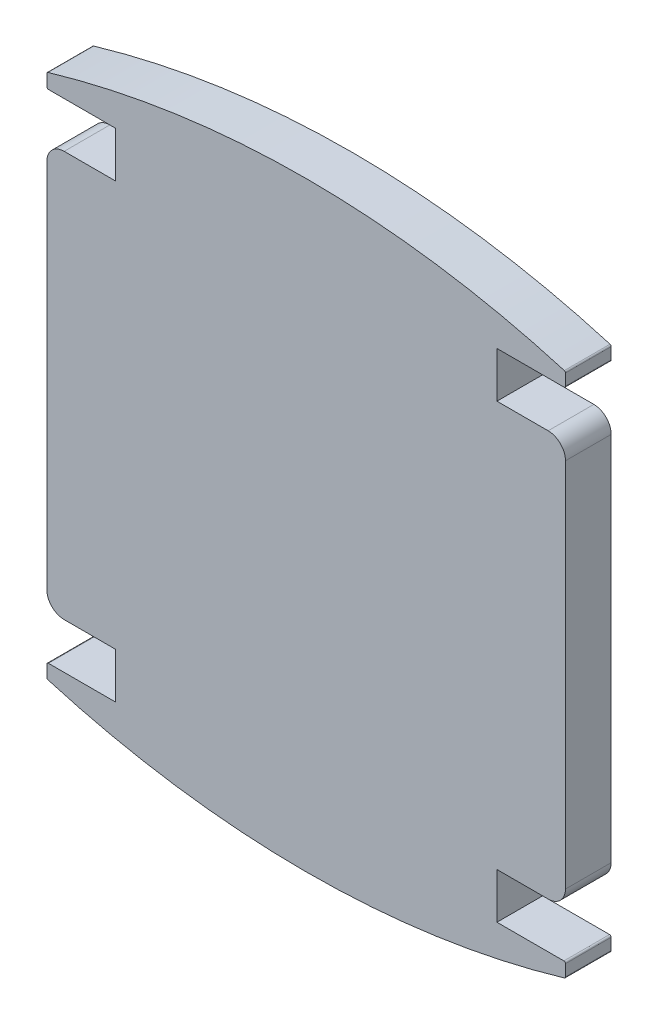
ISO-10303-21;
HEADER;
FILE_DESCRIPTION(('STEP AP214'),'2;1');
FILE_NAME('part.step','',(''),(''),'','','');
FILE_SCHEMA(('AUTOMOTIVE_DESIGN { 1 0 10303 214 1 1 1 1 }'));
ENDSEC;
DATA;
#1=APPLICATION_CONTEXT('core data for automotive mechanical design processes');
#2=APPLICATION_PROTOCOL_DEFINITION('international standard','automotive_design',2000,#1);
#3=PRODUCT_CONTEXT('',#1,'mechanical');
#4=PRODUCT('Part','Part','',(#3));
#5=PRODUCT_RELATED_PRODUCT_CATEGORY('part','',(#4));
#6=PRODUCT_DEFINITION_FORMATION('','',#4);
#7=PRODUCT_DEFINITION_CONTEXT('part definition',#1,'design');
#8=PRODUCT_DEFINITION('design','',#6,#7);
#9=PRODUCT_DEFINITION_SHAPE('','',#8);
#10=(LENGTH_UNIT() NAMED_UNIT(*) SI_UNIT(.MILLI.,.METRE.));
#11=(NAMED_UNIT(*) PLANE_ANGLE_UNIT() SI_UNIT($,.RADIAN.));
#12=(NAMED_UNIT(*) SI_UNIT($,.STERADIAN.) SOLID_ANGLE_UNIT());
#13=UNCERTAINTY_MEASURE_WITH_UNIT(LENGTH_MEASURE(1.E-05),#10,'distance_accuracy_value','');
#14=(GEOMETRIC_REPRESENTATION_CONTEXT(3) GLOBAL_UNCERTAINTY_ASSIGNED_CONTEXT((#13)) GLOBAL_UNIT_ASSIGNED_CONTEXT((#10,
#11,#12)) REPRESENTATION_CONTEXT('',''));
#15=CARTESIAN_POINT('',(0.,0.,0.));
#16=DIRECTION('',(0.,0.,1.));
#17=DIRECTION('',(1.,0.,0.));
#18=AXIS2_PLACEMENT_3D('',#15,#16,#17);
#19=CARTESIAN_POINT('',(8.35,8.875,2.));
#20=DIRECTION('',(-1.,0.,0.));
#21=DIRECTION('',(0.,-1.,0.));
#22=AXIS2_PLACEMENT_3D('',#19,#20,#21);
#23=PLANE('',#22);
#24=DIRECTION('',(0.,1.,0.));
#25=VECTOR('',#24,1.);
#26=CARTESIAN_POINT('',(8.35,8.875,0.));
#27=LINE('',#26,#25);
#28=CARTESIAN_POINT('',(8.35,8.875,0.));
#29=VERTEX_POINT('',#28);
#30=CARTESIAN_POINT('',(8.35,10.875,0.));
#31=VERTEX_POINT('',#30);
#32=EDGE_CURVE('E284',#29,#31,#27,.T.);
#33=ORIENTED_EDGE('',*,*,#32,.T.);
#34=DIRECTION('',(0.,0.,-1.));
#35=VECTOR('',#34,1.);
#36=CARTESIAN_POINT('',(8.35,10.875,2.));
#37=LINE('',#36,#35);
#38=CARTESIAN_POINT('',(8.35,10.875,2.));
#39=VERTEX_POINT('',#38);
#40=EDGE_CURVE('E11',#39,#31,#37,.T.);
#41=ORIENTED_EDGE('',*,*,#40,.F.);
#42=DIRECTION('',(0.,1.,0.));
#43=VECTOR('',#42,1.);
#44=CARTESIAN_POINT('',(8.35,8.875,2.));
#45=LINE('',#44,#43);
#46=CARTESIAN_POINT('',(8.35,8.875,2.));
#47=VERTEX_POINT('',#46);
#48=EDGE_CURVE('E378',#47,#39,#45,.T.);
#49=ORIENTED_EDGE('',*,*,#48,.F.);
#50=DIRECTION('',(0.,0.,-1.));
#51=VECTOR('',#50,1.);
#52=CARTESIAN_POINT('',(8.35,8.875,2.));
#53=LINE('',#52,#51);
#54=EDGE_CURVE('E280',#47,#29,#53,.T.);
#55=ORIENTED_EDGE('',*,*,#54,.T.);
#56=EDGE_LOOP('',(#33,#41,#49,#55));
#57=FACE_BOUND('',#56,.T.);
#58=ADVANCED_FACE('F39',(#57),#23,.F.);
#59=CARTESIAN_POINT('',(8.35,10.875,2.));
#60=DIRECTION('',(0.,1.,0.));
#61=DIRECTION('',(0.,0.,1.));
#62=AXIS2_PLACEMENT_3D('',#59,#60,#61);
#63=PLANE('',#62);
#64=DIRECTION('',(1.,0.,0.));
#65=VECTOR('',#64,1.);
#66=CARTESIAN_POINT('',(8.35,10.875,0.));
#67=LINE('',#66,#65);
#68=CARTESIAN_POINT('',(11.28,10.875,0.));
#69=VERTEX_POINT('',#68);
#70=EDGE_CURVE('E288',#31,#69,#67,.T.);
#71=ORIENTED_EDGE('',*,*,#70,.T.);
#72=DIRECTION('',(0.,0.,-1.));
#73=VECTOR('',#72,1.);
#74=CARTESIAN_POINT('',(11.28,10.875,2.));
#75=LINE('',#74,#73);
#76=CARTESIAN_POINT('',(11.28,10.875,2.));
#77=VERTEX_POINT('',#76);
#78=EDGE_CURVE('E48',#77,#69,#75,.T.);
#79=ORIENTED_EDGE('',*,*,#78,.F.);
#80=DIRECTION('',(1.,0.,0.));
#81=VECTOR('',#80,1.);
#82=CARTESIAN_POINT('',(8.35,10.875,2.));
#83=LINE('',#82,#81);
#84=EDGE_CURVE('E171',#39,#77,#83,.T.);
#85=ORIENTED_EDGE('',*,*,#84,.F.);
#86=ORIENTED_EDGE('',*,*,#40,.T.);
#87=EDGE_LOOP('',(#71,#79,#85,#86));
#88=FACE_BOUND('',#87,.T.);
#89=ADVANCED_FACE('F612',(#88),#63,.F.);
#90=CARTESIAN_POINT('',(11.28,10.945,2.));
#91=DIRECTION('',(0.,0.,-1.));
#92=DIRECTION('',(-1.,0.,0.));
#93=AXIS2_PLACEMENT_3D('',#90,#91,#92);
#94=CYLINDRICAL_SURFACE('',#93,0.0700000000000015);
#95=CARTESIAN_POINT('',(11.28,10.945,0.));
#96=DIRECTION('',(0.,0.,1.));
#97=DIRECTION('',(1.,0.,0.));
#98=AXIS2_PLACEMENT_3D('',#95,#96,#97);
#99=CIRCLE('',#98,0.0700000000000015);
#100=CARTESIAN_POINT('',(11.35,10.945,0.));
#101=VERTEX_POINT('',#100);
#102=EDGE_CURVE('E291',#69,#101,#99,.T.);
#103=ORIENTED_EDGE('',*,*,#102,.T.);
#104=DIRECTION('',(0.,0.,-1.));
#105=VECTOR('',#104,1.);
#106=CARTESIAN_POINT('',(11.35,10.945,2.));
#107=LINE('',#106,#105);
#108=CARTESIAN_POINT('',(11.35,10.945,2.));
#109=VERTEX_POINT('',#108);
#110=EDGE_CURVE('E485',#109,#101,#107,.T.);
#111=ORIENTED_EDGE('',*,*,#110,.F.);
#112=CARTESIAN_POINT('',(11.28,10.945,2.));
#113=DIRECTION('',(0.,0.,1.));
#114=DIRECTION('',(1.,0.,0.));
#115=AXIS2_PLACEMENT_3D('',#112,#113,#114);
#116=CIRCLE('',#115,0.0700000000000015);
#117=EDGE_CURVE('E495',#77,#109,#116,.T.);
#118=ORIENTED_EDGE('',*,*,#117,.F.);
#119=ORIENTED_EDGE('',*,*,#78,.T.);
#120=EDGE_LOOP('',(#103,#111,#118,#119));
#121=FACE_BOUND('',#120,.T.);
#122=ADVANCED_FACE('F493',(#121),#94,.T.);
#123=CARTESIAN_POINT('',(11.35,10.945,2.));
#124=DIRECTION('',(-1.,0.,0.));
#125=DIRECTION('',(0.,-1.,0.));
#126=AXIS2_PLACEMENT_3D('',#123,#124,#125);
#127=PLANE('',#126);
#128=DIRECTION('',(0.,1.,0.));
#129=VECTOR('',#128,1.);
#130=CARTESIAN_POINT('',(11.35,10.945,0.));
#131=LINE('',#130,#129);
#132=CARTESIAN_POINT('',(11.35,11.445,0.));
#133=VERTEX_POINT('',#132);
#134=EDGE_CURVE('E294',#101,#133,#131,.T.);
#135=ORIENTED_EDGE('',*,*,#134,.T.);
#136=DIRECTION('',(0.,0.,-1.));
#137=VECTOR('',#136,1.);
#138=CARTESIAN_POINT('',(11.35,11.445,2.));
#139=LINE('',#138,#137);
#140=CARTESIAN_POINT('',(11.35,11.445,2.));
#141=VERTEX_POINT('',#140);
#142=EDGE_CURVE('E481',#141,#133,#139,.T.);
#143=ORIENTED_EDGE('',*,*,#142,.F.);
#144=DIRECTION('',(0.,1.,0.));
#145=VECTOR('',#144,1.);
#146=CARTESIAN_POINT('',(11.35,10.945,2.));
#147=LINE('',#146,#145);
#148=EDGE_CURVE('E514',#109,#141,#147,.T.);
#149=ORIENTED_EDGE('',*,*,#148,.F.);
#150=ORIENTED_EDGE('',*,*,#110,.T.);
#151=EDGE_LOOP('',(#135,#143,#149,#150));
#152=FACE_BOUND('',#151,.T.);
#153=ADVANCED_FACE('F504',(#152),#127,.F.);
#154=CARTESIAN_POINT('',(11.28,11.445,2.));
#155=DIRECTION('',(0.,0.,-1.));
#156=DIRECTION('',(-1.,0.,0.));
#157=AXIS2_PLACEMENT_3D('',#154,#155,#156);
#158=CYLINDRICAL_SURFACE('',#157,0.0699999999999983);
#159=CARTESIAN_POINT('',(11.28,11.445,0.));
#160=DIRECTION('',(0.,0.,1.));
#161=DIRECTION('',(1.,0.,0.));
#162=AXIS2_PLACEMENT_3D('',#159,#160,#161);
#163=CIRCLE('',#162,0.0699999999999983);
#164=CARTESIAN_POINT('',(11.2997746055597,11.5121488270557,0.));
#165=VERTEX_POINT('',#164);
#166=EDGE_CURVE('E297',#133,#165,#163,.T.);
#167=ORIENTED_EDGE('',*,*,#166,.T.);
#168=DIRECTION('',(0.,0.,-1.));
#169=VECTOR('',#168,1.);
#170=CARTESIAN_POINT('',(11.2997746055597,11.5121488270557,2.));
#171=LINE('',#170,#169);
#172=CARTESIAN_POINT('',(11.2997746055597,11.5121488270557,2.));
#173=VERTEX_POINT('',#172);
#174=EDGE_CURVE('E477',#173,#165,#171,.T.);
#175=ORIENTED_EDGE('',*,*,#174,.F.);
#176=CARTESIAN_POINT('',(11.28,11.445,2.));
#177=DIRECTION('',(0.,0.,1.));
#178=DIRECTION('',(1.,0.,0.));
#179=AXIS2_PLACEMENT_3D('',#176,#177,#178);
#180=CIRCLE('',#179,0.0699999999999983);
#181=EDGE_CURVE('E510',#141,#173,#180,.T.);
#182=ORIENTED_EDGE('',*,*,#181,.F.);
#183=ORIENTED_EDGE('',*,*,#142,.T.);
#184=EDGE_LOOP('',(#167,#175,#182,#183));
#185=FACE_BOUND('',#184,.T.);
#186=ADVANCED_FACE('F508',(#185),#158,.T.);
#187=CARTESIAN_POINT('',(0.,-26.8586094904906,2.));
#188=DIRECTION('',(0.,0.,-1.));
#189=DIRECTION('',(-1.,0.,0.));
#190=AXIS2_PLACEMENT_3D('',#187,#188,#189);
#191=CYLINDRICAL_SURFACE('',#190,40.);
#192=CARTESIAN_POINT('',(0.,-26.8586094904906,0.));
#193=DIRECTION('',(0.,0.,1.));
#194=DIRECTION('',(1.,0.,0.));
#195=AXIS2_PLACEMENT_3D('',#192,#193,#194);
#196=CIRCLE('',#195,40.);
#197=CARTESIAN_POINT('',(-11.2997746055597,11.5121488270557,0.));
#198=VERTEX_POINT('',#197);
#199=EDGE_CURVE('E300',#165,#198,#196,.T.);
#200=ORIENTED_EDGE('',*,*,#199,.T.);
#201=DIRECTION('',(0.,0.,-1.));
#202=VECTOR('',#201,1.);
#203=CARTESIAN_POINT('',(-11.2997746055597,11.5121488270557,2.));
#204=LINE('',#203,#202);
#205=CARTESIAN_POINT('',(-11.2997746055597,11.5121488270557,2.));
#206=VERTEX_POINT('',#205);
#207=EDGE_CURVE('E473',#206,#198,#204,.T.);
#208=ORIENTED_EDGE('',*,*,#207,.F.);
#209=CARTESIAN_POINT('',(0.,-26.8586094904906,2.));
#210=DIRECTION('',(0.,0.,1.));
#211=DIRECTION('',(1.,0.,0.));
#212=AXIS2_PLACEMENT_3D('',#209,#210,#211);
#213=CIRCLE('',#212,40.);
#214=EDGE_CURVE('E513',#173,#206,#213,.T.);
#215=ORIENTED_EDGE('',*,*,#214,.F.);
#216=ORIENTED_EDGE('',*,*,#174,.T.);
#217=EDGE_LOOP('',(#200,#208,#215,#216));
#218=FACE_BOUND('',#217,.T.);
#219=ADVANCED_FACE('F625',(#218),#191,.T.);
#220=CARTESIAN_POINT('',(-11.28,11.445,2.));
#221=DIRECTION('',(0.,0.,-1.));
#222=DIRECTION('',(-1.,0.,0.));
#223=AXIS2_PLACEMENT_3D('',#220,#221,#222);
#224=CYLINDRICAL_SURFACE('',#223,0.0699999999999994);
#225=CARTESIAN_POINT('',(-11.28,11.445,0.));
#226=DIRECTION('',(0.,0.,1.));
#227=DIRECTION('',(1.,0.,0.));
#228=AXIS2_PLACEMENT_3D('',#225,#226,#227);
#229=CIRCLE('',#228,0.0699999999999994);
#230=CARTESIAN_POINT('',(-11.35,11.445,0.));
#231=VERTEX_POINT('',#230);
#232=EDGE_CURVE('E303',#198,#231,#229,.T.);
#233=ORIENTED_EDGE('',*,*,#232,.T.);
#234=DIRECTION('',(0.,0.,-1.));
#235=VECTOR('',#234,1.);
#236=CARTESIAN_POINT('',(-11.35,11.445,2.));
#237=LINE('',#236,#235);
#238=CARTESIAN_POINT('',(-11.35,11.445,2.));
#239=VERTEX_POINT('',#238);
#240=EDGE_CURVE('E469',#239,#231,#237,.T.);
#241=ORIENTED_EDGE('',*,*,#240,.F.);
#242=CARTESIAN_POINT('',(-11.28,11.445,2.));
#243=DIRECTION('',(0.,0.,1.));
#244=DIRECTION('',(1.,0.,0.));
#245=AXIS2_PLACEMENT_3D('',#242,#243,#244);
#246=CIRCLE('',#245,0.0699999999999994);
#247=EDGE_CURVE('E518',#206,#239,#246,.T.);
#248=ORIENTED_EDGE('',*,*,#247,.F.);
#249=ORIENTED_EDGE('',*,*,#207,.T.);
#250=EDGE_LOOP('',(#233,#241,#248,#249));
#251=FACE_BOUND('',#250,.T.);
#252=ADVANCED_FACE('F628',(#251),#224,.T.);
#253=CARTESIAN_POINT('',(-11.35,11.445,2.));
#254=DIRECTION('',(1.,0.,0.));
#255=DIRECTION('',(0.,1.,0.));
#256=AXIS2_PLACEMENT_3D('',#253,#254,#255);
#257=PLANE('',#256);
#258=DIRECTION('',(0.,-1.,0.));
#259=VECTOR('',#258,1.);
#260=CARTESIAN_POINT('',(-11.35,11.445,0.));
#261=LINE('',#260,#259);
#262=CARTESIAN_POINT('',(-11.35,10.945,0.));
#263=VERTEX_POINT('',#262);
#264=EDGE_CURVE('E306',#231,#263,#261,.T.);
#265=ORIENTED_EDGE('',*,*,#264,.T.);
#266=DIRECTION('',(0.,0.,-1.));
#267=VECTOR('',#266,1.);
#268=CARTESIAN_POINT('',(-11.35,10.945,2.));
#269=LINE('',#268,#267);
#270=CARTESIAN_POINT('',(-11.35,10.945,2.));
#271=VERTEX_POINT('',#270);
#272=EDGE_CURVE('E465',#271,#263,#269,.T.);
#273=ORIENTED_EDGE('',*,*,#272,.F.);
#274=DIRECTION('',(0.,-1.,0.));
#275=VECTOR('',#274,1.);
#276=CARTESIAN_POINT('',(-11.35,11.445,2.));
#277=LINE('',#276,#275);
#278=EDGE_CURVE('E525',#239,#271,#277,.T.);
#279=ORIENTED_EDGE('',*,*,#278,.F.);
#280=ORIENTED_EDGE('',*,*,#240,.T.);
#281=EDGE_LOOP('',(#265,#273,#279,#280));
#282=FACE_BOUND('',#281,.T.);
#283=ADVANCED_FACE('F632',(#282),#257,.F.);
#284=CARTESIAN_POINT('',(-11.28,10.945,2.));
#285=DIRECTION('',(0.,0.,-1.));
#286=DIRECTION('',(-1.,0.,0.));
#287=AXIS2_PLACEMENT_3D('',#284,#285,#286);
#288=CYLINDRICAL_SURFACE('',#287,0.0700000000000084);
#289=CARTESIAN_POINT('',(-11.28,10.945,0.));
#290=DIRECTION('',(0.,0.,1.));
#291=DIRECTION('',(1.,0.,0.));
#292=AXIS2_PLACEMENT_3D('',#289,#290,#291);
#293=CIRCLE('',#292,0.0700000000000084);
#294=CARTESIAN_POINT('',(-11.28,10.875,0.));
#295=VERTEX_POINT('',#294);
#296=EDGE_CURVE('E309',#263,#295,#293,.T.);
#297=ORIENTED_EDGE('',*,*,#296,.T.);
#298=DIRECTION('',(0.,0.,-1.));
#299=VECTOR('',#298,1.);
#300=CARTESIAN_POINT('',(-11.28,10.875,2.));
#301=LINE('',#300,#299);
#302=CARTESIAN_POINT('',(-11.28,10.875,2.));
#303=VERTEX_POINT('',#302);
#304=EDGE_CURVE('E461',#303,#295,#301,.T.);
#305=ORIENTED_EDGE('',*,*,#304,.F.);
#306=CARTESIAN_POINT('',(-11.28,10.945,2.));
#307=DIRECTION('',(0.,0.,1.));
#308=DIRECTION('',(1.,0.,0.));
#309=AXIS2_PLACEMENT_3D('',#306,#307,#308);
#310=CIRCLE('',#309,0.0700000000000084);
#311=EDGE_CURVE('E528',#271,#303,#310,.T.);
#312=ORIENTED_EDGE('',*,*,#311,.F.);
#313=ORIENTED_EDGE('',*,*,#272,.T.);
#314=EDGE_LOOP('',(#297,#305,#312,#313));
#315=FACE_BOUND('',#314,.T.);
#316=ADVANCED_FACE('F636',(#315),#288,.T.);
#317=CARTESIAN_POINT('',(-11.28,10.875,2.));
#318=DIRECTION('',(0.,1.,0.));
#319=DIRECTION('',(-1.,0.,0.));
#320=AXIS2_PLACEMENT_3D('',#317,#318,#319);
#321=PLANE('',#320);
#322=DIRECTION('',(1.,0.,0.));
#323=VECTOR('',#322,1.);
#324=CARTESIAN_POINT('',(-11.28,10.875,0.));
#325=LINE('',#324,#323);
#326=CARTESIAN_POINT('',(-8.35,10.875,0.));
#327=VERTEX_POINT('',#326);
#328=EDGE_CURVE('E312',#295,#327,#325,.T.);
#329=ORIENTED_EDGE('',*,*,#328,.T.);
#330=DIRECTION('',(0.,0.,-1.));
#331=VECTOR('',#330,1.);
#332=CARTESIAN_POINT('',(-8.35,10.875,2.));
#333=LINE('',#332,#331);
#334=CARTESIAN_POINT('',(-8.35,10.875,2.));
#335=VERTEX_POINT('',#334);
#336=EDGE_CURVE('E457',#335,#327,#333,.T.);
#337=ORIENTED_EDGE('',*,*,#336,.F.);
#338=DIRECTION('',(1.,0.,0.));
#339=VECTOR('',#338,1.);
#340=CARTESIAN_POINT('',(-11.28,10.875,2.));
#341=LINE('',#340,#339);
#342=EDGE_CURVE('E531',#303,#335,#341,.T.);
#343=ORIENTED_EDGE('',*,*,#342,.F.);
#344=ORIENTED_EDGE('',*,*,#304,.T.);
#345=EDGE_LOOP('',(#329,#337,#343,#344));
#346=FACE_BOUND('',#345,.T.);
#347=ADVANCED_FACE('F640',(#346),#321,.F.);
#348=CARTESIAN_POINT('',(-8.35,10.875,2.));
#349=DIRECTION('',(1.,0.,0.));
#350=DIRECTION('',(0.,1.,0.));
#351=AXIS2_PLACEMENT_3D('',#348,#349,#350);
#352=PLANE('',#351);
#353=DIRECTION('',(0.,-1.,0.));
#354=VECTOR('',#353,1.);
#355=CARTESIAN_POINT('',(-8.35,10.875,0.));
#356=LINE('',#355,#354);
#357=CARTESIAN_POINT('',(-8.35,8.875,0.));
#358=VERTEX_POINT('',#357);
#359=EDGE_CURVE('E315',#327,#358,#356,.T.);
#360=ORIENTED_EDGE('',*,*,#359,.T.);
#361=DIRECTION('',(0.,0.,-1.));
#362=VECTOR('',#361,1.);
#363=CARTESIAN_POINT('',(-8.35,8.875,2.));
#364=LINE('',#363,#362);
#365=CARTESIAN_POINT('',(-8.35,8.875,2.));
#366=VERTEX_POINT('',#365);
#367=EDGE_CURVE('E453',#366,#358,#364,.T.);
#368=ORIENTED_EDGE('',*,*,#367,.F.);
#369=DIRECTION('',(0.,-1.,0.));
#370=VECTOR('',#369,1.);
#371=CARTESIAN_POINT('',(-8.35,10.875,2.));
#372=LINE('',#371,#370);
#373=EDGE_CURVE('E534',#335,#366,#372,.T.);
#374=ORIENTED_EDGE('',*,*,#373,.F.);
#375=ORIENTED_EDGE('',*,*,#336,.T.);
#376=EDGE_LOOP('',(#360,#368,#374,#375));
#377=FACE_BOUND('',#376,.T.);
#378=ADVANCED_FACE('F644',(#377),#352,.F.);
#379=CARTESIAN_POINT('',(-8.35,8.875,2.));
#380=DIRECTION('',(0.,-1.,0.));
#381=DIRECTION('',(1.,0.,0.));
#382=AXIS2_PLACEMENT_3D('',#379,#380,#381);
#383=PLANE('',#382);
#384=DIRECTION('',(-1.,0.,0.));
#385=VECTOR('',#384,1.);
#386=CARTESIAN_POINT('',(-8.35,8.875,0.));
#387=LINE('',#386,#385);
#388=CARTESIAN_POINT('',(-10.5916201094082,8.875,0.));
#389=VERTEX_POINT('',#388);
#390=EDGE_CURVE('E318',#358,#389,#387,.T.);
#391=ORIENTED_EDGE('',*,*,#390,.T.);
#392=DIRECTION('',(0.,0.,-1.));
#393=VECTOR('',#392,1.);
#394=CARTESIAN_POINT('',(-10.5916201094082,8.875,2.));
#395=LINE('',#394,#393);
#396=CARTESIAN_POINT('',(-10.5916201094082,8.875,2.));
#397=VERTEX_POINT('',#396);
#398=EDGE_CURVE('E449',#397,#389,#395,.T.);
#399=ORIENTED_EDGE('',*,*,#398,.F.);
#400=DIRECTION('',(-1.,0.,0.));
#401=VECTOR('',#400,1.);
#402=CARTESIAN_POINT('',(-8.35,8.875,2.));
#403=LINE('',#402,#401);
#404=EDGE_CURVE('E537',#366,#397,#403,.T.);
#405=ORIENTED_EDGE('',*,*,#404,.F.);
#406=ORIENTED_EDGE('',*,*,#367,.T.);
#407=EDGE_LOOP('',(#391,#399,#405,#406));
#408=FACE_BOUND('',#407,.T.);
#409=ADVANCED_FACE('F648',(#408),#383,.F.);
#410=CARTESIAN_POINT('',(-10.5916201094082,8.11662010940824,2.));
#411=DIRECTION('',(0.,0.,-1.));
#412=DIRECTION('',(-1.,0.,0.));
#413=AXIS2_PLACEMENT_3D('',#410,#411,#412);
#414=CYLINDRICAL_SURFACE('',#413,0.758379890591757);
#415=CARTESIAN_POINT('',(-10.5916201094082,8.11662010940824,0.));
#416=DIRECTION('',(0.,0.,1.));
#417=DIRECTION('',(1.,0.,0.));
#418=AXIS2_PLACEMENT_3D('',#415,#416,#417);
#419=CIRCLE('',#418,0.758379890591757);
#420=CARTESIAN_POINT('',(-11.35,8.11662010940824,0.));
#421=VERTEX_POINT('',#420);
#422=EDGE_CURVE('E321',#389,#421,#419,.T.);
#423=ORIENTED_EDGE('',*,*,#422,.T.);
#424=DIRECTION('',(0.,0.,-1.));
#425=VECTOR('',#424,1.);
#426=CARTESIAN_POINT('',(-11.35,8.11662010940824,2.));
#427=LINE('',#426,#425);
#428=CARTESIAN_POINT('',(-11.35,8.11662010940824,2.));
#429=VERTEX_POINT('',#428);
#430=EDGE_CURVE('E445',#429,#421,#427,.T.);
#431=ORIENTED_EDGE('',*,*,#430,.F.);
#432=CARTESIAN_POINT('',(-10.5916201094082,8.11662010940824,2.));
#433=DIRECTION('',(0.,0.,1.));
#434=DIRECTION('',(1.,0.,0.));
#435=AXIS2_PLACEMENT_3D('',#432,#433,#434);
#436=CIRCLE('',#435,0.758379890591757);
#437=EDGE_CURVE('E540',#397,#429,#436,.T.);
#438=ORIENTED_EDGE('',*,*,#437,.F.);
#439=ORIENTED_EDGE('',*,*,#398,.T.);
#440=EDGE_LOOP('',(#423,#431,#438,#439));
#441=FACE_BOUND('',#440,.T.);
#442=ADVANCED_FACE('F652',(#441),#414,.T.);
#443=CARTESIAN_POINT('',(-11.35,8.11662010940824,2.));
#444=DIRECTION('',(1.,0.,0.));
#445=DIRECTION('',(0.,1.,0.));
#446=AXIS2_PLACEMENT_3D('',#443,#444,#445);
#447=PLANE('',#446);
#448=DIRECTION('',(0.,-1.,0.));
#449=VECTOR('',#448,1.);
#450=CARTESIAN_POINT('',(-11.35,8.11662010940824,0.));
#451=LINE('',#450,#449);
#452=CARTESIAN_POINT('',(-11.35,-8.11662010940824,0.));
#453=VERTEX_POINT('',#452);
#454=EDGE_CURVE('E324',#421,#453,#451,.T.);
#455=ORIENTED_EDGE('',*,*,#454,.T.);
#456=DIRECTION('',(0.,0.,-1.));
#457=VECTOR('',#456,1.);
#458=CARTESIAN_POINT('',(-11.35,-8.11662010940824,2.));
#459=LINE('',#458,#457);
#460=CARTESIAN_POINT('',(-11.35,-8.11662010940824,2.));
#461=VERTEX_POINT('',#460);
#462=EDGE_CURVE('E441',#461,#453,#459,.T.);
#463=ORIENTED_EDGE('',*,*,#462,.F.);
#464=DIRECTION('',(0.,-1.,0.));
#465=VECTOR('',#464,1.);
#466=CARTESIAN_POINT('',(-11.35,8.11662010940824,2.));
#467=LINE('',#466,#465);
#468=EDGE_CURVE('E543',#429,#461,#467,.T.);
#469=ORIENTED_EDGE('',*,*,#468,.F.);
#470=ORIENTED_EDGE('',*,*,#430,.T.);
#471=EDGE_LOOP('',(#455,#463,#469,#470));
#472=FACE_BOUND('',#471,.T.);
#473=ADVANCED_FACE('F656',(#472),#447,.F.);
#474=CARTESIAN_POINT('',(-10.5916201094082,-8.11662010940824,2.));
#475=DIRECTION('',(0.,0.,-1.));
#476=DIRECTION('',(-1.,0.,0.));
#477=AXIS2_PLACEMENT_3D('',#474,#475,#476);
#478=CYLINDRICAL_SURFACE('',#477,0.758379890591757);
#479=CARTESIAN_POINT('',(-10.5916201094082,-8.11662010940824,0.));
#480=DIRECTION('',(0.,0.,1.));
#481=DIRECTION('',(1.,0.,0.));
#482=AXIS2_PLACEMENT_3D('',#479,#480,#481);
#483=CIRCLE('',#482,0.758379890591757);
#484=CARTESIAN_POINT('',(-10.5916201094082,-8.875,0.));
#485=VERTEX_POINT('',#484);
#486=EDGE_CURVE('E327',#453,#485,#483,.T.);
#487=ORIENTED_EDGE('',*,*,#486,.T.);
#488=DIRECTION('',(0.,0.,-1.));
#489=VECTOR('',#488,1.);
#490=CARTESIAN_POINT('',(-10.5916201094082,-8.875,2.));
#491=LINE('',#490,#489);
#492=CARTESIAN_POINT('',(-10.5916201094082,-8.875,2.));
#493=VERTEX_POINT('',#492);
#494=EDGE_CURVE('E437',#493,#485,#491,.T.);
#495=ORIENTED_EDGE('',*,*,#494,.F.);
#496=CARTESIAN_POINT('',(-10.5916201094082,-8.11662010940824,2.));
#497=DIRECTION('',(0.,0.,1.));
#498=DIRECTION('',(1.,0.,0.));
#499=AXIS2_PLACEMENT_3D('',#496,#497,#498);
#500=CIRCLE('',#499,0.758379890591757);
#501=EDGE_CURVE('E546',#461,#493,#500,.T.);
#502=ORIENTED_EDGE('',*,*,#501,.F.);
#503=ORIENTED_EDGE('',*,*,#462,.T.);
#504=EDGE_LOOP('',(#487,#495,#502,#503));
#505=FACE_BOUND('',#504,.T.);
#506=ADVANCED_FACE('F660',(#505),#478,.T.);
#507=CARTESIAN_POINT('',(-10.5916201094082,-8.875,2.));
#508=DIRECTION('',(0.,1.,0.));
#509=DIRECTION('',(-1.,0.,0.));
#510=AXIS2_PLACEMENT_3D('',#507,#508,#509);
#511=PLANE('',#510);
#512=DIRECTION('',(1.,0.,0.));
#513=VECTOR('',#512,1.);
#514=CARTESIAN_POINT('',(-10.5916201094082,-8.875,0.));
#515=LINE('',#514,#513);
#516=CARTESIAN_POINT('',(-8.35,-8.875,0.));
#517=VERTEX_POINT('',#516);
#518=EDGE_CURVE('E330',#485,#517,#515,.T.);
#519=ORIENTED_EDGE('',*,*,#518,.T.);
#520=DIRECTION('',(0.,0.,-1.));
#521=VECTOR('',#520,1.);
#522=CARTESIAN_POINT('',(-8.35,-8.875,2.));
#523=LINE('',#522,#521);
#524=CARTESIAN_POINT('',(-8.35,-8.875,2.));
#525=VERTEX_POINT('',#524);
#526=EDGE_CURVE('E433',#525,#517,#523,.T.);
#527=ORIENTED_EDGE('',*,*,#526,.F.);
#528=DIRECTION('',(1.,0.,0.));
#529=VECTOR('',#528,1.);
#530=CARTESIAN_POINT('',(-10.5916201094082,-8.875,2.));
#531=LINE('',#530,#529);
#532=EDGE_CURVE('E549',#493,#525,#531,.T.);
#533=ORIENTED_EDGE('',*,*,#532,.F.);
#534=ORIENTED_EDGE('',*,*,#494,.T.);
#535=EDGE_LOOP('',(#519,#527,#533,#534));
#536=FACE_BOUND('',#535,.T.);
#537=ADVANCED_FACE('F664',(#536),#511,.F.);
#538=CARTESIAN_POINT('',(-8.35,-8.875,2.));
#539=DIRECTION('',(1.,0.,0.));
#540=DIRECTION('',(0.,1.,0.));
#541=AXIS2_PLACEMENT_3D('',#538,#539,#540);
#542=PLANE('',#541);
#543=DIRECTION('',(0.,-1.,0.));
#544=VECTOR('',#543,1.);
#545=CARTESIAN_POINT('',(-8.35,-8.875,0.));
#546=LINE('',#545,#544);
#547=CARTESIAN_POINT('',(-8.34999999999999,-10.875,0.));
#548=VERTEX_POINT('',#547);
#549=EDGE_CURVE('E333',#517,#548,#546,.T.);
#550=ORIENTED_EDGE('',*,*,#549,.T.);
#551=DIRECTION('',(0.,0.,-1.));
#552=VECTOR('',#551,1.);
#553=CARTESIAN_POINT('',(-8.34999999999999,-10.875,2.));
#554=LINE('',#553,#552);
#555=CARTESIAN_POINT('',(-8.34999999999999,-10.875,2.));
#556=VERTEX_POINT('',#555);
#557=EDGE_CURVE('E429',#556,#548,#554,.T.);
#558=ORIENTED_EDGE('',*,*,#557,.F.);
#559=DIRECTION('',(0.,-1.,0.));
#560=VECTOR('',#559,1.);
#561=CARTESIAN_POINT('',(-8.35,-8.875,2.));
#562=LINE('',#561,#560);
#563=EDGE_CURVE('E552',#525,#556,#562,.T.);
#564=ORIENTED_EDGE('',*,*,#563,.F.);
#565=ORIENTED_EDGE('',*,*,#526,.T.);
#566=EDGE_LOOP('',(#550,#558,#564,#565));
#567=FACE_BOUND('',#566,.T.);
#568=ADVANCED_FACE('F668',(#567),#542,.F.);
#569=CARTESIAN_POINT('',(-11.28,-10.875,2.));
#570=DIRECTION('',(0.,-1.,0.));
#571=DIRECTION('',(1.,0.,0.));
#572=AXIS2_PLACEMENT_3D('',#569,#570,#571);
#573=PLANE('',#572);
#574=DIRECTION('',(-1.,0.,0.));
#575=VECTOR('',#574,1.);
#576=CARTESIAN_POINT('',(-11.28,-10.875,0.));
#577=LINE('',#576,#575);
#578=CARTESIAN_POINT('',(-11.28,-10.875,0.));
#579=VERTEX_POINT('',#578);
#580=EDGE_CURVE('E336',#548,#579,#577,.T.);
#581=ORIENTED_EDGE('',*,*,#580,.T.);
#582=DIRECTION('',(0.,0.,-1.));
#583=VECTOR('',#582,1.);
#584=CARTESIAN_POINT('',(-11.28,-10.875,2.));
#585=LINE('',#584,#583);
#586=CARTESIAN_POINT('',(-11.28,-10.875,2.));
#587=VERTEX_POINT('',#586);
#588=EDGE_CURVE('E425',#587,#579,#585,.T.);
#589=ORIENTED_EDGE('',*,*,#588,.F.);
#590=DIRECTION('',(-1.,0.,0.));
#591=VECTOR('',#590,1.);
#592=CARTESIAN_POINT('',(-11.28,-10.875,2.));
#593=LINE('',#592,#591);
#594=EDGE_CURVE('E555',#556,#587,#593,.T.);
#595=ORIENTED_EDGE('',*,*,#594,.F.);
#596=ORIENTED_EDGE('',*,*,#557,.T.);
#597=EDGE_LOOP('',(#581,#589,#595,#596));
#598=FACE_BOUND('',#597,.T.);
#599=ADVANCED_FACE('F672',(#598),#573,.F.);
#600=CARTESIAN_POINT('',(-11.28,-10.945,2.));
#601=DIRECTION('',(0.,0.,-1.));
#602=DIRECTION('',(-1.,0.,0.));
#603=AXIS2_PLACEMENT_3D('',#600,#601,#602);
#604=CYLINDRICAL_SURFACE('',#603,0.0700000000000015);
#605=CARTESIAN_POINT('',(-11.28,-10.945,0.));
#606=DIRECTION('',(0.,0.,1.));
#607=DIRECTION('',(-1.,0.,0.));
#608=AXIS2_PLACEMENT_3D('',#605,#606,#607);
#609=CIRCLE('',#608,0.0700000000000015);
#610=CARTESIAN_POINT('',(-11.35,-10.945,0.));
#611=VERTEX_POINT('',#610);
#612=EDGE_CURVE('E339',#579,#611,#609,.T.);
#613=ORIENTED_EDGE('',*,*,#612,.T.);
#614=DIRECTION('',(0.,0.,-1.));
#615=VECTOR('',#614,1.);
#616=CARTESIAN_POINT('',(-11.35,-10.945,2.));
#617=LINE('',#616,#615);
#618=CARTESIAN_POINT('',(-11.35,-10.945,2.));
#619=VERTEX_POINT('',#618);
#620=EDGE_CURVE('E421',#619,#611,#617,.T.);
#621=ORIENTED_EDGE('',*,*,#620,.F.);
#622=CARTESIAN_POINT('',(-11.28,-10.945,2.));
#623=DIRECTION('',(0.,0.,1.));
#624=DIRECTION('',(-1.,0.,0.));
#625=AXIS2_PLACEMENT_3D('',#622,#623,#624);
#626=CIRCLE('',#625,0.0700000000000015);
#627=EDGE_CURVE('E558',#587,#619,#626,.T.);
#628=ORIENTED_EDGE('',*,*,#627,.F.);
#629=ORIENTED_EDGE('',*,*,#588,.T.);
#630=EDGE_LOOP('',(#613,#621,#628,#629));
#631=FACE_BOUND('',#630,.T.);
#632=ADVANCED_FACE('F676',(#631),#604,.T.);
#633=CARTESIAN_POINT('',(-11.35,-11.445,2.));
#634=DIRECTION('',(1.,0.,0.));
#635=DIRECTION('',(0.,1.,0.));
#636=AXIS2_PLACEMENT_3D('',#633,#634,#635);
#637=PLANE('',#636);
#638=DIRECTION('',(0.,-1.,0.));
#639=VECTOR('',#638,1.);
#640=CARTESIAN_POINT('',(-11.35,-11.445,0.));
#641=LINE('',#640,#639);
#642=CARTESIAN_POINT('',(-11.35,-11.445,0.));
#643=VERTEX_POINT('',#642);
#644=EDGE_CURVE('E342',#611,#643,#641,.T.);
#645=ORIENTED_EDGE('',*,*,#644,.T.);
#646=DIRECTION('',(0.,0.,-1.));
#647=VECTOR('',#646,1.);
#648=CARTESIAN_POINT('',(-11.35,-11.445,2.));
#649=LINE('',#648,#647);
#650=CARTESIAN_POINT('',(-11.35,-11.445,2.));
#651=VERTEX_POINT('',#650);
#652=EDGE_CURVE('E417',#651,#643,#649,.T.);
#653=ORIENTED_EDGE('',*,*,#652,.F.);
#654=DIRECTION('',(0.,-1.,0.));
#655=VECTOR('',#654,1.);
#656=CARTESIAN_POINT('',(-11.35,-11.445,2.));
#657=LINE('',#656,#655);
#658=EDGE_CURVE('E561',#619,#651,#657,.T.);
#659=ORIENTED_EDGE('',*,*,#658,.F.);
#660=ORIENTED_EDGE('',*,*,#620,.T.);
#661=EDGE_LOOP('',(#645,#653,#659,#660));
#662=FACE_BOUND('',#661,.T.);
#663=ADVANCED_FACE('F680',(#662),#637,.F.);
#664=CARTESIAN_POINT('',(-11.28,-11.445,2.));
#665=DIRECTION('',(0.,0.,-1.));
#666=DIRECTION('',(-1.,0.,0.));
#667=AXIS2_PLACEMENT_3D('',#664,#665,#666);
#668=CYLINDRICAL_SURFACE('',#667,0.069999999999996);
#669=CARTESIAN_POINT('',(-11.28,-11.445,0.));
#670=DIRECTION('',(0.,0.,1.));
#671=DIRECTION('',(-1.,0.,0.));
#672=AXIS2_PLACEMENT_3D('',#669,#670,#671);
#673=CIRCLE('',#672,0.069999999999996);
#674=CARTESIAN_POINT('',(-11.2997746055597,-11.5121488270557,0.));
#675=VERTEX_POINT('',#674);
#676=EDGE_CURVE('E345',#643,#675,#673,.T.);
#677=ORIENTED_EDGE('',*,*,#676,.T.);
#678=DIRECTION('',(0.,0.,-1.));
#679=VECTOR('',#678,1.);
#680=CARTESIAN_POINT('',(-11.2997746055597,-11.5121488270557,2.));
#681=LINE('',#680,#679);
#682=CARTESIAN_POINT('',(-11.2997746055597,-11.5121488270557,2.));
#683=VERTEX_POINT('',#682);
#684=EDGE_CURVE('E413',#683,#675,#681,.T.);
#685=ORIENTED_EDGE('',*,*,#684,.F.);
#686=CARTESIAN_POINT('',(-11.28,-11.445,2.));
#687=DIRECTION('',(0.,0.,1.));
#688=DIRECTION('',(-1.,0.,0.));
#689=AXIS2_PLACEMENT_3D('',#686,#687,#688);
#690=CIRCLE('',#689,0.069999999999996);
#691=EDGE_CURVE('E564',#651,#683,#690,.T.);
#692=ORIENTED_EDGE('',*,*,#691,.F.);
#693=ORIENTED_EDGE('',*,*,#652,.T.);
#694=EDGE_LOOP('',(#677,#685,#692,#693));
#695=FACE_BOUND('',#694,.T.);
#696=ADVANCED_FACE('F684',(#695),#668,.T.);
#697=CARTESIAN_POINT('',(0.,26.8586094904906,2.));
#698=DIRECTION('',(0.,0.,-1.));
#699=DIRECTION('',(-1.,0.,0.));
#700=AXIS2_PLACEMENT_3D('',#697,#698,#699);
#701=CYLINDRICAL_SURFACE('',#700,40.);
#702=CARTESIAN_POINT('',(0.,26.8586094904906,0.));
#703=DIRECTION('',(0.,0.,1.));
#704=DIRECTION('',(-1.,0.,0.));
#705=AXIS2_PLACEMENT_3D('',#702,#703,#704);
#706=CIRCLE('',#705,40.);
#707=CARTESIAN_POINT('',(11.2997746055597,-11.5121488270557,0.));
#708=VERTEX_POINT('',#707);
#709=EDGE_CURVE('E348',#675,#708,#706,.T.);
#710=ORIENTED_EDGE('',*,*,#709,.T.);
#711=DIRECTION('',(0.,0.,-1.));
#712=VECTOR('',#711,1.);
#713=CARTESIAN_POINT('',(11.2997746055597,-11.5121488270557,2.));
#714=LINE('',#713,#712);
#715=CARTESIAN_POINT('',(11.2997746055597,-11.5121488270557,2.));
#716=VERTEX_POINT('',#715);
#717=EDGE_CURVE('E409',#716,#708,#714,.T.);
#718=ORIENTED_EDGE('',*,*,#717,.F.);
#719=CARTESIAN_POINT('',(0.,26.8586094904906,2.));
#720=DIRECTION('',(0.,0.,1.));
#721=DIRECTION('',(-1.,0.,0.));
#722=AXIS2_PLACEMENT_3D('',#719,#720,#721);
#723=CIRCLE('',#722,40.);
#724=EDGE_CURVE('E567',#683,#716,#723,.T.);
#725=ORIENTED_EDGE('',*,*,#724,.F.);
#726=ORIENTED_EDGE('',*,*,#684,.T.);
#727=EDGE_LOOP('',(#710,#718,#725,#726));
#728=FACE_BOUND('',#727,.T.);
#729=ADVANCED_FACE('F688',(#728),#701,.T.);
#730=CARTESIAN_POINT('',(11.28,-11.445,2.));
#731=DIRECTION('',(0.,0.,-1.));
#732=DIRECTION('',(-1.,0.,0.));
#733=AXIS2_PLACEMENT_3D('',#730,#731,#732);
#734=CYLINDRICAL_SURFACE('',#733,0.0699999999999983);
#735=CARTESIAN_POINT('',(11.28,-11.445,0.));
#736=DIRECTION('',(0.,0.,1.));
#737=DIRECTION('',(-1.,0.,0.));
#738=AXIS2_PLACEMENT_3D('',#735,#736,#737);
#739=CIRCLE('',#738,0.0699999999999983);
#740=CARTESIAN_POINT('',(11.35,-11.445,0.));
#741=VERTEX_POINT('',#740);
#742=EDGE_CURVE('E351',#708,#741,#739,.T.);
#743=ORIENTED_EDGE('',*,*,#742,.T.);
#744=DIRECTION('',(0.,0.,-1.));
#745=VECTOR('',#744,1.);
#746=CARTESIAN_POINT('',(11.35,-11.445,2.));
#747=LINE('',#746,#745);
#748=CARTESIAN_POINT('',(11.35,-11.445,2.));
#749=VERTEX_POINT('',#748);
#750=EDGE_CURVE('E405',#749,#741,#747,.T.);
#751=ORIENTED_EDGE('',*,*,#750,.F.);
#752=CARTESIAN_POINT('',(11.28,-11.445,2.));
#753=DIRECTION('',(0.,0.,1.));
#754=DIRECTION('',(-1.,0.,0.));
#755=AXIS2_PLACEMENT_3D('',#752,#753,#754);
#756=CIRCLE('',#755,0.0699999999999983);
#757=EDGE_CURVE('E570',#716,#749,#756,.T.);
#758=ORIENTED_EDGE('',*,*,#757,.F.);
#759=ORIENTED_EDGE('',*,*,#717,.T.);
#760=EDGE_LOOP('',(#743,#751,#758,#759));
#761=FACE_BOUND('',#760,.T.);
#762=ADVANCED_FACE('F692',(#761),#734,.T.);
#763=CARTESIAN_POINT('',(11.35,-10.945,2.));
#764=DIRECTION('',(-1.,0.,0.));
#765=DIRECTION('',(0.,-1.,0.));
#766=AXIS2_PLACEMENT_3D('',#763,#764,#765);
#767=PLANE('',#766);
#768=DIRECTION('',(0.,1.,0.));
#769=VECTOR('',#768,1.);
#770=CARTESIAN_POINT('',(11.35,-10.945,0.));
#771=LINE('',#770,#769);
#772=CARTESIAN_POINT('',(11.35,-10.945,0.));
#773=VERTEX_POINT('',#772);
#774=EDGE_CURVE('E354',#741,#773,#771,.T.);
#775=ORIENTED_EDGE('',*,*,#774,.T.);
#776=DIRECTION('',(0.,0.,-1.));
#777=VECTOR('',#776,1.);
#778=CARTESIAN_POINT('',(11.35,-10.945,2.));
#779=LINE('',#778,#777);
#780=CARTESIAN_POINT('',(11.35,-10.945,2.));
#781=VERTEX_POINT('',#780);
#782=EDGE_CURVE('E401',#781,#773,#779,.T.);
#783=ORIENTED_EDGE('',*,*,#782,.F.);
#784=DIRECTION('',(0.,1.,0.));
#785=VECTOR('',#784,1.);
#786=CARTESIAN_POINT('',(11.35,-10.945,2.));
#787=LINE('',#786,#785);
#788=EDGE_CURVE('E573',#749,#781,#787,.T.);
#789=ORIENTED_EDGE('',*,*,#788,.F.);
#790=ORIENTED_EDGE('',*,*,#750,.T.);
#791=EDGE_LOOP('',(#775,#783,#789,#790));
#792=FACE_BOUND('',#791,.T.);
#793=ADVANCED_FACE('F696',(#792),#767,.F.);
#794=CARTESIAN_POINT('',(11.28,-10.945,2.));
#795=DIRECTION('',(0.,0.,-1.));
#796=DIRECTION('',(-1.,0.,0.));
#797=AXIS2_PLACEMENT_3D('',#794,#795,#796);
#798=CYLINDRICAL_SURFACE('',#797,0.0700000000000015);
#799=CARTESIAN_POINT('',(11.28,-10.945,0.));
#800=DIRECTION('',(0.,0.,1.));
#801=DIRECTION('',(-1.,0.,0.));
#802=AXIS2_PLACEMENT_3D('',#799,#800,#801);
#803=CIRCLE('',#802,0.0700000000000015);
#804=CARTESIAN_POINT('',(11.28,-10.875,0.));
#805=VERTEX_POINT('',#804);
#806=EDGE_CURVE('E357',#773,#805,#803,.T.);
#807=ORIENTED_EDGE('',*,*,#806,.T.);
#808=DIRECTION('',(0.,0.,-1.));
#809=VECTOR('',#808,1.);
#810=CARTESIAN_POINT('',(11.28,-10.875,2.));
#811=LINE('',#810,#809);
#812=CARTESIAN_POINT('',(11.28,-10.875,2.));
#813=VERTEX_POINT('',#812);
#814=EDGE_CURVE('E397',#813,#805,#811,.T.);
#815=ORIENTED_EDGE('',*,*,#814,.F.);
#816=CARTESIAN_POINT('',(11.28,-10.945,2.));
#817=DIRECTION('',(0.,0.,1.));
#818=DIRECTION('',(-1.,0.,0.));
#819=AXIS2_PLACEMENT_3D('',#816,#817,#818);
#820=CIRCLE('',#819,0.0700000000000015);
#821=EDGE_CURVE('E576',#781,#813,#820,.T.);
#822=ORIENTED_EDGE('',*,*,#821,.F.);
#823=ORIENTED_EDGE('',*,*,#782,.T.);
#824=EDGE_LOOP('',(#807,#815,#822,#823));
#825=FACE_BOUND('',#824,.T.);
#826=ADVANCED_FACE('F700',(#825),#798,.T.);
#827=CARTESIAN_POINT('',(8.35,-10.875,2.));
#828=DIRECTION('',(0.,-1.,0.));
#829=DIRECTION('',(0.,0.,-1.));
#830=AXIS2_PLACEMENT_3D('',#827,#828,#829);
#831=PLANE('',#830);
#832=DIRECTION('',(-1.,0.,0.));
#833=VECTOR('',#832,1.);
#834=CARTESIAN_POINT('',(8.35,-10.875,0.));
#835=LINE('',#834,#833);
#836=CARTESIAN_POINT('',(8.35,-10.875,0.));
#837=VERTEX_POINT('',#836);
#838=EDGE_CURVE('E360',#805,#837,#835,.T.);
#839=ORIENTED_EDGE('',*,*,#838,.T.);
#840=DIRECTION('',(0.,0.,-1.));
#841=VECTOR('',#840,1.);
#842=CARTESIAN_POINT('',(8.35,-10.875,2.));
#843=LINE('',#842,#841);
#844=CARTESIAN_POINT('',(8.35,-10.875,2.));
#845=VERTEX_POINT('',#844);
#846=EDGE_CURVE('E393',#845,#837,#843,.T.);
#847=ORIENTED_EDGE('',*,*,#846,.F.);
#848=DIRECTION('',(-1.,0.,0.));
#849=VECTOR('',#848,1.);
#850=CARTESIAN_POINT('',(8.35,-10.875,2.));
#851=LINE('',#850,#849);
#852=EDGE_CURVE('E579',#813,#845,#851,.T.);
#853=ORIENTED_EDGE('',*,*,#852,.F.);
#854=ORIENTED_EDGE('',*,*,#814,.T.);
#855=EDGE_LOOP('',(#839,#847,#853,#854));
#856=FACE_BOUND('',#855,.T.);
#857=ADVANCED_FACE('F704',(#856),#831,.F.);
#858=CARTESIAN_POINT('',(8.35,-10.875,2.));
#859=DIRECTION('',(-1.,0.,0.));
#860=DIRECTION('',(0.,-1.,0.));
#861=AXIS2_PLACEMENT_3D('',#858,#859,#860);
#862=PLANE('',#861);
#863=DIRECTION('',(0.,1.,0.));
#864=VECTOR('',#863,1.);
#865=CARTESIAN_POINT('',(8.35,-10.875,0.));
#866=LINE('',#865,#864);
#867=CARTESIAN_POINT('',(8.35,-8.875,0.));
#868=VERTEX_POINT('',#867);
#869=EDGE_CURVE('E363',#837,#868,#866,.T.);
#870=ORIENTED_EDGE('',*,*,#869,.T.);
#871=DIRECTION('',(0.,0.,-1.));
#872=VECTOR('',#871,1.);
#873=CARTESIAN_POINT('',(8.35,-8.875,2.));
#874=LINE('',#873,#872);
#875=CARTESIAN_POINT('',(8.35,-8.875,2.));
#876=VERTEX_POINT('',#875);
#877=EDGE_CURVE('E389',#876,#868,#874,.T.);
#878=ORIENTED_EDGE('',*,*,#877,.F.);
#879=DIRECTION('',(0.,1.,0.));
#880=VECTOR('',#879,1.);
#881=CARTESIAN_POINT('',(8.35,-10.875,2.));
#882=LINE('',#881,#880);
#883=EDGE_CURVE('E582',#845,#876,#882,.T.);
#884=ORIENTED_EDGE('',*,*,#883,.F.);
#885=ORIENTED_EDGE('',*,*,#846,.T.);
#886=EDGE_LOOP('',(#870,#878,#884,#885));
#887=FACE_BOUND('',#886,.T.);
#888=ADVANCED_FACE('F708',(#887),#862,.F.);
#889=CARTESIAN_POINT('',(8.35,-8.875,2.));
#890=DIRECTION('',(0.,1.,0.));
#891=DIRECTION('',(-1.,0.,0.));
#892=AXIS2_PLACEMENT_3D('',#889,#890,#891);
#893=PLANE('',#892);
#894=DIRECTION('',(1.,0.,0.));
#895=VECTOR('',#894,1.);
#896=CARTESIAN_POINT('',(8.35,-8.875,0.));
#897=LINE('',#896,#895);
#898=CARTESIAN_POINT('',(10.5916201094082,-8.875,0.));
#899=VERTEX_POINT('',#898);
#900=EDGE_CURVE('E366',#868,#899,#897,.T.);
#901=ORIENTED_EDGE('',*,*,#900,.T.);
#902=DIRECTION('',(0.,0.,-1.));
#903=VECTOR('',#902,1.);
#904=CARTESIAN_POINT('',(10.5916201094082,-8.875,2.));
#905=LINE('',#904,#903);
#906=CARTESIAN_POINT('',(10.5916201094082,-8.875,2.));
#907=VERTEX_POINT('',#906);
#908=EDGE_CURVE('E385',#907,#899,#905,.T.);
#909=ORIENTED_EDGE('',*,*,#908,.F.);
#910=DIRECTION('',(1.,0.,0.));
#911=VECTOR('',#910,1.);
#912=CARTESIAN_POINT('',(8.35,-8.875,2.));
#913=LINE('',#912,#911);
#914=EDGE_CURVE('E585',#876,#907,#913,.T.);
#915=ORIENTED_EDGE('',*,*,#914,.F.);
#916=ORIENTED_EDGE('',*,*,#877,.T.);
#917=EDGE_LOOP('',(#901,#909,#915,#916));
#918=FACE_BOUND('',#917,.T.);
#919=ADVANCED_FACE('F593',(#918),#893,.F.);
#920=CARTESIAN_POINT('',(10.5916201094082,-8.11662010940824,2.));
#921=DIRECTION('',(0.,0.,-1.));
#922=DIRECTION('',(-1.,0.,0.));
#923=AXIS2_PLACEMENT_3D('',#920,#921,#922);
#924=CYLINDRICAL_SURFACE('',#923,0.758379890591755);
#925=CARTESIAN_POINT('',(10.5916201094082,-8.11662010940824,0.));
#926=DIRECTION('',(0.,0.,1.));
#927=DIRECTION('',(1.,0.,0.));
#928=AXIS2_PLACEMENT_3D('',#925,#926,#927);
#929=CIRCLE('',#928,0.758379890591755);
#930=CARTESIAN_POINT('',(11.35,-8.11662010940824,0.));
#931=VERTEX_POINT('',#930);
#932=EDGE_CURVE('E369',#899,#931,#929,.T.);
#933=ORIENTED_EDGE('',*,*,#932,.T.);
#934=DIRECTION('',(0.,0.,-1.));
#935=VECTOR('',#934,1.);
#936=CARTESIAN_POINT('',(11.35,-8.11662010940824,2.));
#937=LINE('',#936,#935);
#938=CARTESIAN_POINT('',(11.35,-8.11662010940824,2.));
#939=VERTEX_POINT('',#938);
#940=EDGE_CURVE('E273',#939,#931,#937,.T.);
#941=ORIENTED_EDGE('',*,*,#940,.F.);
#942=CARTESIAN_POINT('',(10.5916201094082,-8.11662010940824,2.));
#943=DIRECTION('',(0.,0.,1.));
#944=DIRECTION('',(1.,0.,0.));
#945=AXIS2_PLACEMENT_3D('',#942,#943,#944);
#946=CIRCLE('',#945,0.758379890591755);
#947=EDGE_CURVE('E262',#907,#939,#946,.T.);
#948=ORIENTED_EDGE('',*,*,#947,.F.);
#949=ORIENTED_EDGE('',*,*,#908,.T.);
#950=EDGE_LOOP('',(#933,#941,#948,#949));
#951=FACE_BOUND('',#950,.T.);
#952=ADVANCED_FACE('F597',(#951),#924,.T.);
#953=CARTESIAN_POINT('',(11.35,-8.11662010940824,2.));
#954=DIRECTION('',(-1.,0.,0.));
#955=DIRECTION('',(0.,-1.,0.));
#956=AXIS2_PLACEMENT_3D('',#953,#954,#955);
#957=PLANE('',#956);
#958=DIRECTION('',(0.,1.,0.));
#959=VECTOR('',#958,1.);
#960=CARTESIAN_POINT('',(11.35,-8.11662010940824,0.));
#961=LINE('',#960,#959);
#962=CARTESIAN_POINT('',(11.35,8.11662010940824,0.));
#963=VERTEX_POINT('',#962);
#964=EDGE_CURVE('E271',#931,#963,#961,.T.);
#965=ORIENTED_EDGE('',*,*,#964,.T.);
#966=DIRECTION('',(0.,0.,-1.));
#967=VECTOR('',#966,1.);
#968=CARTESIAN_POINT('',(11.35,8.11662010940824,2.));
#969=LINE('',#968,#967);
#970=CARTESIAN_POINT('',(11.35,8.11662010940824,2.));
#971=VERTEX_POINT('',#970);
#972=EDGE_CURVE('E268',#971,#963,#969,.T.);
#973=ORIENTED_EDGE('',*,*,#972,.F.);
#974=DIRECTION('',(0.,1.,0.));
#975=VECTOR('',#974,1.);
#976=CARTESIAN_POINT('',(11.35,-8.11662010940824,2.));
#977=LINE('',#976,#975);
#978=EDGE_CURVE('E256',#939,#971,#977,.T.);
#979=ORIENTED_EDGE('',*,*,#978,.F.);
#980=ORIENTED_EDGE('',*,*,#940,.T.);
#981=EDGE_LOOP('',(#965,#973,#979,#980));
#982=FACE_BOUND('',#981,.T.);
#983=ADVANCED_FACE('F269',(#982),#957,.F.);
#984=CARTESIAN_POINT('',(10.5916201094082,8.11662010940824,2.));
#985=DIRECTION('',(0.,0.,-1.));
#986=DIRECTION('',(-1.,0.,0.));
#987=AXIS2_PLACEMENT_3D('',#984,#985,#986);
#988=CYLINDRICAL_SURFACE('',#987,0.758379890591757);
#989=CARTESIAN_POINT('',(10.5916201094082,8.11662010940824,0.));
#990=DIRECTION('',(0.,0.,1.));
#991=DIRECTION('',(1.,0.,0.));
#992=AXIS2_PLACEMENT_3D('',#989,#990,#991);
#993=CIRCLE('',#992,0.758379890591757);
#994=CARTESIAN_POINT('',(10.5916201094082,8.875,0.));
#995=VERTEX_POINT('',#994);
#996=EDGE_CURVE('E157',#963,#995,#993,.T.);
#997=ORIENTED_EDGE('',*,*,#996,.T.);
#998=DIRECTION('',(0.,0.,-1.));
#999=VECTOR('',#998,1.);
#1000=CARTESIAN_POINT('',(10.5916201094082,8.875,2.));
#1001=LINE('',#1000,#999);
#1002=CARTESIAN_POINT('',(10.5916201094082,8.875,2.));
#1003=VERTEX_POINT('',#1002);
#1004=EDGE_CURVE('E274',#1003,#995,#1001,.T.);
#1005=ORIENTED_EDGE('',*,*,#1004,.F.);
#1006=CARTESIAN_POINT('',(10.5916201094082,8.11662010940824,2.));
#1007=DIRECTION('',(0.,0.,1.));
#1008=DIRECTION('',(1.,0.,0.));
#1009=AXIS2_PLACEMENT_3D('',#1006,#1007,#1008);
#1010=CIRCLE('',#1009,0.758379890591757);
#1011=EDGE_CURVE('E260',#971,#1003,#1010,.T.);
#1012=ORIENTED_EDGE('',*,*,#1011,.F.);
#1013=ORIENTED_EDGE('',*,*,#972,.T.);
#1014=EDGE_LOOP('',(#997,#1005,#1012,#1013));
#1015=FACE_BOUND('',#1014,.T.);
#1016=ADVANCED_FACE('F276',(#1015),#988,.T.);
#1017=CARTESIAN_POINT('',(10.5916201094082,8.875,2.));
#1018=DIRECTION('',(0.,-1.,0.));
#1019=DIRECTION('',(0.,0.,-1.));
#1020=AXIS2_PLACEMENT_3D('',#1017,#1018,#1019);
#1021=PLANE('',#1020);
#1022=DIRECTION('',(-1.,0.,0.));
#1023=VECTOR('',#1022,1.);
#1024=CARTESIAN_POINT('',(10.5916201094082,8.875,0.));
#1025=LINE('',#1024,#1023);
#1026=EDGE_CURVE('E163',#995,#29,#1025,.T.);
#1027=ORIENTED_EDGE('',*,*,#1026,.T.);
#1028=ORIENTED_EDGE('',*,*,#54,.F.);
#1029=DIRECTION('',(-1.,0.,0.));
#1030=VECTOR('',#1029,1.);
#1031=CARTESIAN_POINT('',(10.5916201094082,8.875,2.));
#1032=LINE('',#1031,#1030);
#1033=EDGE_CURVE('E56',#1003,#47,#1032,.T.);
#1034=ORIENTED_EDGE('',*,*,#1033,.F.);
#1035=ORIENTED_EDGE('',*,*,#1004,.T.);
#1036=EDGE_LOOP('',(#1027,#1028,#1034,#1035));
#1037=FACE_BOUND('',#1036,.T.);
#1038=ADVANCED_FACE('F601',(#1037),#1021,.F.);
#1039=CARTESIAN_POINT('',(11.28,10.945,2.));
#1040=DIRECTION('',(0.,0.,1.));
#1041=DIRECTION('',(1.,0.,0.));
#1042=AXIS2_PLACEMENT_3D('',#1039,#1040,#1041);
#1043=PLANE('',#1042);
#1044=ORIENTED_EDGE('',*,*,#48,.T.);
#1045=ORIENTED_EDGE('',*,*,#84,.T.);
#1046=ORIENTED_EDGE('',*,*,#117,.T.);
#1047=ORIENTED_EDGE('',*,*,#148,.T.);
#1048=ORIENTED_EDGE('',*,*,#181,.T.);
#1049=ORIENTED_EDGE('',*,*,#214,.T.);
#1050=ORIENTED_EDGE('',*,*,#247,.T.);
#1051=ORIENTED_EDGE('',*,*,#278,.T.);
#1052=ORIENTED_EDGE('',*,*,#311,.T.);
#1053=ORIENTED_EDGE('',*,*,#342,.T.);
#1054=ORIENTED_EDGE('',*,*,#373,.T.);
#1055=ORIENTED_EDGE('',*,*,#404,.T.);
#1056=ORIENTED_EDGE('',*,*,#437,.T.);
#1057=ORIENTED_EDGE('',*,*,#468,.T.);
#1058=ORIENTED_EDGE('',*,*,#501,.T.);
#1059=ORIENTED_EDGE('',*,*,#532,.T.);
#1060=ORIENTED_EDGE('',*,*,#563,.T.);
#1061=ORIENTED_EDGE('',*,*,#594,.T.);
#1062=ORIENTED_EDGE('',*,*,#627,.T.);
#1063=ORIENTED_EDGE('',*,*,#658,.T.);
#1064=ORIENTED_EDGE('',*,*,#691,.T.);
#1065=ORIENTED_EDGE('',*,*,#724,.T.);
#1066=ORIENTED_EDGE('',*,*,#757,.T.);
#1067=ORIENTED_EDGE('',*,*,#788,.T.);
#1068=ORIENTED_EDGE('',*,*,#821,.T.);
#1069=ORIENTED_EDGE('',*,*,#852,.T.);
#1070=ORIENTED_EDGE('',*,*,#883,.T.);
#1071=ORIENTED_EDGE('',*,*,#914,.T.);
#1072=ORIENTED_EDGE('',*,*,#947,.T.);
#1073=ORIENTED_EDGE('',*,*,#978,.T.);
#1074=ORIENTED_EDGE('',*,*,#1011,.T.);
#1075=ORIENTED_EDGE('',*,*,#1033,.T.);
#1076=EDGE_LOOP('',(#1044,#1045,#1046,#1047,#1048,#1049,#1050,#1051,#1052,#1053,#1054,#1055,
#1056,#1057,#1058,#1059,#1060,#1061,#1062,#1063,#1064,#1065,#1066,#1067,#1068,#1069,#1070,#1071,
#1072,#1073,#1074,#1075));
#1077=FACE_BOUND('',#1076,.T.);
#1078=ADVANCED_FACE('F258',(#1077),#1043,.T.);
#1079=CARTESIAN_POINT('',(11.28,10.945,0.));
#1080=DIRECTION('',(0.,0.,1.));
#1081=DIRECTION('',(1.,0.,0.));
#1082=AXIS2_PLACEMENT_3D('',#1079,#1080,#1081);
#1083=PLANE('',#1082);
#1084=ORIENTED_EDGE('',*,*,#32,.F.);
#1085=ORIENTED_EDGE('',*,*,#1026,.F.);
#1086=ORIENTED_EDGE('',*,*,#996,.F.);
#1087=ORIENTED_EDGE('',*,*,#964,.F.);
#1088=ORIENTED_EDGE('',*,*,#932,.F.);
#1089=ORIENTED_EDGE('',*,*,#900,.F.);
#1090=ORIENTED_EDGE('',*,*,#869,.F.);
#1091=ORIENTED_EDGE('',*,*,#838,.F.);
#1092=ORIENTED_EDGE('',*,*,#806,.F.);
#1093=ORIENTED_EDGE('',*,*,#774,.F.);
#1094=ORIENTED_EDGE('',*,*,#742,.F.);
#1095=ORIENTED_EDGE('',*,*,#709,.F.);
#1096=ORIENTED_EDGE('',*,*,#676,.F.);
#1097=ORIENTED_EDGE('',*,*,#644,.F.);
#1098=ORIENTED_EDGE('',*,*,#612,.F.);
#1099=ORIENTED_EDGE('',*,*,#580,.F.);
#1100=ORIENTED_EDGE('',*,*,#549,.F.);
#1101=ORIENTED_EDGE('',*,*,#518,.F.);
#1102=ORIENTED_EDGE('',*,*,#486,.F.);
#1103=ORIENTED_EDGE('',*,*,#454,.F.);
#1104=ORIENTED_EDGE('',*,*,#422,.F.);
#1105=ORIENTED_EDGE('',*,*,#390,.F.);
#1106=ORIENTED_EDGE('',*,*,#359,.F.);
#1107=ORIENTED_EDGE('',*,*,#328,.F.);
#1108=ORIENTED_EDGE('',*,*,#296,.F.);
#1109=ORIENTED_EDGE('',*,*,#264,.F.);
#1110=ORIENTED_EDGE('',*,*,#232,.F.);
#1111=ORIENTED_EDGE('',*,*,#199,.F.);
#1112=ORIENTED_EDGE('',*,*,#166,.F.);
#1113=ORIENTED_EDGE('',*,*,#134,.F.);
#1114=ORIENTED_EDGE('',*,*,#102,.F.);
#1115=ORIENTED_EDGE('',*,*,#70,.F.);
#1116=EDGE_LOOP('',(#1084,#1085,#1086,#1087,#1088,#1089,#1090,#1091,#1092,#1093,#1094,#1095,
#1096,#1097,#1098,#1099,#1100,#1101,#1102,#1103,#1104,#1105,#1106,#1107,#1108,#1109,#1110,#1111,
#1112,#1113,#1114,#1115));
#1117=FACE_BOUND('',#1116,.T.);
#1118=ADVANCED_FACE('F499',(#1117),#1083,.F.);
#1119=CLOSED_SHELL('',(#58,#89,#122,#153,#186,#219,#252,#283,#316,#347,#378,#409,#442,#473,#506,
#537,#568,#599,#632,#663,#696,#729,#762,#793,#826,#857,#888,#919,#952,#983,#1016,#1038,#1078,#1118));
#1120=MANIFOLD_SOLID_BREP('B2',#1119);
#1121=ADVANCED_BREP_SHAPE_REPRESENTATION('',(#18,#1120),#14);
#1122=SHAPE_DEFINITION_REPRESENTATION(#9,#1121);
ENDSEC;
END-ISO-10303-21;
